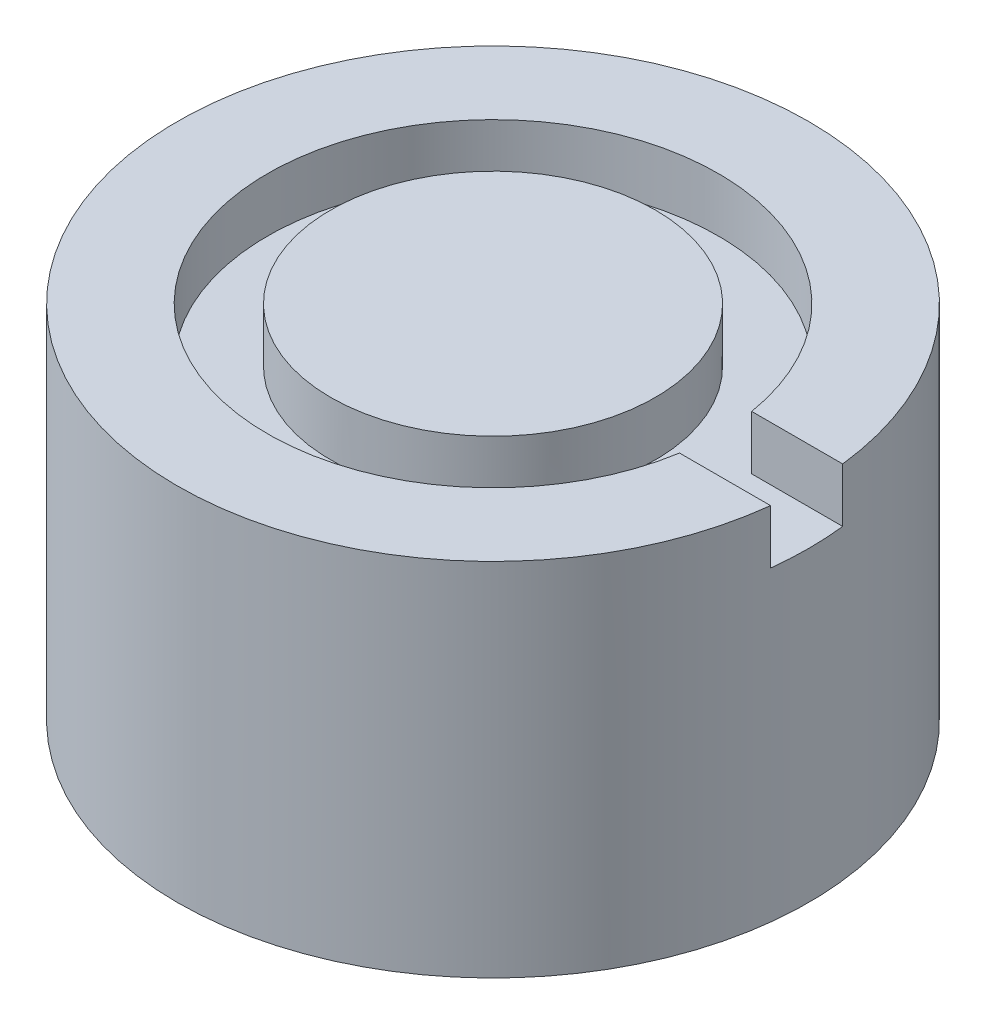
ISO-10303-21;
HEADER;
FILE_DESCRIPTION(('STEP AP214'),'2;1');
FILE_NAME('part.step','',(''),(''),'','','');
FILE_SCHEMA(('AUTOMOTIVE_DESIGN { 1 0 10303 214 1 1 1 1 }'));
ENDSEC;
DATA;
#1=APPLICATION_CONTEXT('core data for automotive mechanical design processes');
#2=APPLICATION_PROTOCOL_DEFINITION('international standard','automotive_design',2000,#1);
#3=PRODUCT_CONTEXT('',#1,'mechanical');
#4=PRODUCT('Part','Part','',(#3));
#5=PRODUCT_RELATED_PRODUCT_CATEGORY('part','',(#4));
#6=PRODUCT_DEFINITION_FORMATION('','',#4);
#7=PRODUCT_DEFINITION_CONTEXT('part definition',#1,'design');
#8=PRODUCT_DEFINITION('design','',#6,#7);
#9=PRODUCT_DEFINITION_SHAPE('','',#8);
#10=(LENGTH_UNIT() NAMED_UNIT(*) SI_UNIT(.MILLI.,.METRE.));
#11=(NAMED_UNIT(*) PLANE_ANGLE_UNIT() SI_UNIT($,.RADIAN.));
#12=(NAMED_UNIT(*) SI_UNIT($,.STERADIAN.) SOLID_ANGLE_UNIT());
#13=UNCERTAINTY_MEASURE_WITH_UNIT(LENGTH_MEASURE(1.E-05),#10,'distance_accuracy_value','');
#14=(GEOMETRIC_REPRESENTATION_CONTEXT(3) GLOBAL_UNCERTAINTY_ASSIGNED_CONTEXT((#13)) GLOBAL_UNIT_ASSIGNED_CONTEXT((#10,
#11,#12)) REPRESENTATION_CONTEXT('',''));
#15=CARTESIAN_POINT('',(0.,0.,0.));
#16=DIRECTION('',(0.,0.,1.));
#17=DIRECTION('',(1.,0.,0.));
#18=AXIS2_PLACEMENT_3D('',#15,#16,#17);
#19=CARTESIAN_POINT('',(0.,-1.,0.));
#20=DIRECTION('',(0.,-1.,0.));
#21=DIRECTION('',(0.,0.,-1.));
#22=AXIS2_PLACEMENT_3D('',#19,#20,#21);
#23=PLANE('',#22);
#24=CARTESIAN_POINT('',(0.,-1.,0.));
#25=DIRECTION('',(0.,-1.,0.));
#26=DIRECTION('',(0.,0.,-1.));
#27=AXIS2_PLACEMENT_3D('',#24,#25,#26);
#28=CIRCLE('',#27,6.);
#29=CARTESIAN_POINT('',(0.,-1.,-6.));
#30=VERTEX_POINT('',#29);
#31=EDGE_CURVE('E137',#30,#30,#28,.T.);
#32=ORIENTED_EDGE('',*,*,#31,.F.);
#33=EDGE_LOOP('',(#32));
#34=FACE_BOUND('',#33,.T.);
#35=CARTESIAN_POINT('',(0.,-1.,0.));
#36=DIRECTION('',(0.,-1.,0.));
#37=DIRECTION('',(0.,0.,-1.));
#38=AXIS2_PLACEMENT_3D('',#35,#36,#37);
#39=CIRCLE('',#38,11.);
#40=CARTESIAN_POINT('',(0.,-1.,-11.));
#41=VERTEX_POINT('',#40);
#42=EDGE_CURVE('E46',#41,#41,#39,.F.);
#43=ORIENTED_EDGE('',*,*,#42,.F.);
#44=EDGE_LOOP('',(#43));
#45=FACE_BOUND('',#44,.T.);
#46=ADVANCED_FACE('F38',(#34,#45),#23,.T.);
#47=CARTESIAN_POINT('',(0.,9.,0.));
#48=DIRECTION('',(0.,-1.,0.));
#49=DIRECTION('',(0.,0.,-1.));
#50=AXIS2_PLACEMENT_3D('',#47,#48,#49);
#51=CYLINDRICAL_SURFACE('',#50,3.05);
#52=CARTESIAN_POINT('',(0.,0.,0.));
#53=DIRECTION('',(0.,1.,0.));
#54=DIRECTION('',(0.,0.,1.));
#55=AXIS2_PLACEMENT_3D('',#52,#53,#54);
#56=CIRCLE('',#55,3.05);
#57=CARTESIAN_POINT('',(0.,0.,3.05));
#58=VERTEX_POINT('',#57);
#59=EDGE_CURVE('E165',#58,#58,#56,.T.);
#60=ORIENTED_EDGE('',*,*,#59,.F.);
#61=EDGE_LOOP('',(#60));
#62=FACE_BOUND('',#61,.T.);
#63=CARTESIAN_POINT('',(0.,9.,0.));
#64=DIRECTION('',(0.,1.,0.));
#65=DIRECTION('',(0.,0.,1.));
#66=AXIS2_PLACEMENT_3D('',#63,#64,#65);
#67=CIRCLE('',#66,3.05);
#68=CARTESIAN_POINT('',(0.45,9.,3.01662062579967));
#69=VERTEX_POINT('',#68);
#70=CARTESIAN_POINT('',(0.45,9.,-3.01662062579967));
#71=VERTEX_POINT('',#70);
#72=EDGE_CURVE('E162',#69,#71,#67,.T.);
#73=ORIENTED_EDGE('',*,*,#72,.T.);
#74=DIRECTION('',(0.,-1.,0.));
#75=VECTOR('',#74,1.);
#76=CARTESIAN_POINT('',(0.45,9.,-3.01662062579967));
#77=LINE('',#76,#75);
#78=CARTESIAN_POINT('',(0.45,8.,-3.01662062579967));
#79=VERTEX_POINT('',#78);
#80=EDGE_CURVE('E156',#71,#79,#77,.T.);
#81=ORIENTED_EDGE('',*,*,#80,.T.);
#82=CARTESIAN_POINT('',(0.,8.,0.));
#83=DIRECTION('',(0.,1.,0.));
#84=DIRECTION('',(0.,0.,1.));
#85=AXIS2_PLACEMENT_3D('',#82,#83,#84);
#86=CIRCLE('',#85,3.05);
#87=CARTESIAN_POINT('',(-0.45,8.,-3.01662062579967));
#88=VERTEX_POINT('',#87);
#89=EDGE_CURVE('E61',#79,#88,#86,.T.);
#90=ORIENTED_EDGE('',*,*,#89,.T.);
#91=DIRECTION('',(0.,-1.,0.));
#92=VECTOR('',#91,1.);
#93=CARTESIAN_POINT('',(-0.45,9.,-3.01662062579967));
#94=LINE('',#93,#92);
#95=CARTESIAN_POINT('',(-0.45,9.,-3.01662062579967));
#96=VERTEX_POINT('',#95);
#97=EDGE_CURVE('E150',#88,#96,#94,.F.);
#98=ORIENTED_EDGE('',*,*,#97,.T.);
#99=CARTESIAN_POINT('',(-0.45,9.,3.01662062579967));
#100=VERTEX_POINT('',#99);
#101=EDGE_CURVE('E161',#96,#100,#67,.T.);
#102=ORIENTED_EDGE('',*,*,#101,.T.);
#103=DIRECTION('',(0.,-1.,0.));
#104=VECTOR('',#103,1.);
#105=CARTESIAN_POINT('',(-0.45,9.,3.01662062579967));
#106=LINE('',#105,#104);
#107=CARTESIAN_POINT('',(-0.45,8.,3.01662062579967));
#108=VERTEX_POINT('',#107);
#109=EDGE_CURVE('E152',#100,#108,#106,.T.);
#110=ORIENTED_EDGE('',*,*,#109,.T.);
#111=CARTESIAN_POINT('',(0.45,8.,3.01662062579967));
#112=VERTEX_POINT('',#111);
#113=EDGE_CURVE('E177',#108,#112,#86,.T.);
#114=ORIENTED_EDGE('',*,*,#113,.T.);
#115=DIRECTION('',(0.,-1.,0.));
#116=VECTOR('',#115,1.);
#117=CARTESIAN_POINT('',(0.45,9.,3.01662062579967));
#118=LINE('',#117,#116);
#119=EDGE_CURVE('E154',#112,#69,#118,.F.);
#120=ORIENTED_EDGE('',*,*,#119,.T.);
#121=EDGE_LOOP('',(#73,#81,#90,#98,#102,#110,#114,#120));
#122=FACE_BOUND('',#121,.T.);
#123=ADVANCED_FACE('F184',(#62,#122),#51,.F.);
#124=CARTESIAN_POINT('',(0.,9.,0.));
#125=DIRECTION('',(0.,1.,0.));
#126=DIRECTION('',(0.,0.,1.));
#127=AXIS2_PLACEMENT_3D('',#124,#125,#126);
#128=PLANE('',#127);
#129=DIRECTION('',(0.,0.,1.));
#130=VECTOR('',#129,1.);
#131=CARTESIAN_POINT('',(0.45,9.,0.));
#132=LINE('',#131,#130);
#133=EDGE_CURVE('E174',#71,#69,#132,.T.);
#134=ORIENTED_EDGE('',*,*,#133,.F.);
#135=ORIENTED_EDGE('',*,*,#72,.F.);
#136=EDGE_LOOP('',(#134,#135));
#137=FACE_BOUND('',#136,.T.);
#138=ADVANCED_FACE('F190',(#137),#128,.F.);
#139=DIRECTION('',(0.,0.,-1.));
#140=VECTOR('',#139,1.);
#141=CARTESIAN_POINT('',(-0.45,9.,0.));
#142=LINE('',#141,#140);
#143=EDGE_CURVE('E171',#100,#96,#142,.T.);
#144=ORIENTED_EDGE('',*,*,#143,.F.);
#145=ORIENTED_EDGE('',*,*,#101,.F.);
#146=EDGE_LOOP('',(#144,#145));
#147=FACE_BOUND('',#146,.T.);
#148=ADVANCED_FACE('F221',(#147),#128,.F.);
#149=CARTESIAN_POINT('',(0.,0.,0.));
#150=DIRECTION('',(0.,1.,0.));
#151=DIRECTION('',(0.,0.,1.));
#152=AXIS2_PLACEMENT_3D('',#149,#150,#151);
#153=PLANE('',#152);
#154=CARTESIAN_POINT('',(0.,0.,0.));
#155=DIRECTION('',(0.,1.,0.));
#156=DIRECTION('',(0.,0.,1.));
#157=AXIS2_PLACEMENT_3D('',#154,#155,#156);
#158=CIRCLE('',#157,6.);
#159=CARTESIAN_POINT('',(0.,0.,6.));
#160=VERTEX_POINT('',#159);
#161=EDGE_CURVE('E168',#160,#160,#158,.T.);
#162=ORIENTED_EDGE('',*,*,#161,.F.);
#163=EDGE_LOOP('',(#162));
#164=FACE_BOUND('',#163,.T.);
#165=ORIENTED_EDGE('',*,*,#59,.T.);
#166=EDGE_LOOP('',(#165));
#167=FACE_BOUND('',#166,.T.);
#168=ADVANCED_FACE('F40',(#164,#167),#153,.F.);
#169=CARTESIAN_POINT('',(0.,8.,0.));
#170=DIRECTION('',(0.,1.,0.));
#171=DIRECTION('',(0.,0.,1.));
#172=AXIS2_PLACEMENT_3D('',#169,#170,#171);
#173=PLANE('',#172);
#174=ORIENTED_EDGE('',*,*,#89,.F.);
#175=DIRECTION('',(0.,0.,1.));
#176=VECTOR('',#175,1.);
#177=CARTESIAN_POINT('',(0.45,8.,-4.37971298198208));
#178=LINE('',#177,#176);
#179=EDGE_CURVE('E144',#79,#112,#178,.T.);
#180=ORIENTED_EDGE('',*,*,#179,.T.);
#181=ORIENTED_EDGE('',*,*,#113,.F.);
#182=DIRECTION('',(0.,0.,-1.));
#183=VECTOR('',#182,1.);
#184=CARTESIAN_POINT('',(-0.45,8.,-4.37971298198208));
#185=LINE('',#184,#183);
#186=EDGE_CURVE('E147',#108,#88,#185,.T.);
#187=ORIENTED_EDGE('',*,*,#186,.T.);
#188=EDGE_LOOP('',(#174,#180,#181,#187));
#189=FACE_BOUND('',#188,.T.);
#190=ADVANCED_FACE('F203',(#189),#173,.F.);
#191=CARTESIAN_POINT('',(0.45,8.,-4.37971298198208));
#192=DIRECTION('',(-1.,0.,0.));
#193=DIRECTION('',(0.,0.,1.));
#194=AXIS2_PLACEMENT_3D('',#191,#192,#193);
#195=PLANE('',#194);
#196=ORIENTED_EDGE('',*,*,#80,.F.);
#197=ORIENTED_EDGE('',*,*,#133,.T.);
#198=ORIENTED_EDGE('',*,*,#119,.F.);
#199=ORIENTED_EDGE('',*,*,#179,.F.);
#200=EDGE_LOOP('',(#196,#197,#198,#199));
#201=FACE_BOUND('',#200,.T.);
#202=ADVANCED_FACE('F206',(#201),#195,.F.);
#203=CARTESIAN_POINT('',(-0.45,8.,-4.37971298198208));
#204=DIRECTION('',(1.,0.,0.));
#205=DIRECTION('',(0.,0.,-1.));
#206=AXIS2_PLACEMENT_3D('',#203,#204,#205);
#207=PLANE('',#206);
#208=ORIENTED_EDGE('',*,*,#109,.F.);
#209=ORIENTED_EDGE('',*,*,#143,.T.);
#210=ORIENTED_EDGE('',*,*,#97,.F.);
#211=ORIENTED_EDGE('',*,*,#186,.F.);
#212=EDGE_LOOP('',(#208,#209,#210,#211));
#213=FACE_BOUND('',#212,.T.);
#214=ADVANCED_FACE('F208',(#213),#207,.F.);
#215=CARTESIAN_POINT('',(0.,-1.,0.));
#216=DIRECTION('',(0.,1.,0.));
#217=DIRECTION('',(0.,0.,1.));
#218=AXIS2_PLACEMENT_3D('',#215,#216,#217);
#219=CYLINDRICAL_SURFACE('',#218,6.);
#220=ORIENTED_EDGE('',*,*,#31,.T.);
#221=EDGE_LOOP('',(#220));
#222=FACE_BOUND('',#221,.T.);
#223=ORIENTED_EDGE('',*,*,#161,.T.);
#224=EDGE_LOOP('',(#223));
#225=FACE_BOUND('',#224,.T.);
#226=ADVANCED_FACE('F195',(#222,#225),#219,.F.);
#227=CARTESIAN_POINT('',(0.,-8.,0.));
#228=DIRECTION('',(0.,-1.,0.));
#229=DIRECTION('',(0.,0.,-1.));
#230=AXIS2_PLACEMENT_3D('',#227,#228,#229);
#231=PLANE('',#230);
#232=CARTESIAN_POINT('',(0.,-8.,0.));
#233=DIRECTION('',(0.,-1.,0.));
#234=DIRECTION('',(0.,0.,-1.));
#235=AXIS2_PLACEMENT_3D('',#232,#233,#234);
#236=CIRCLE('',#235,11.);
#237=CARTESIAN_POINT('',(0.,-8.,-11.));
#238=VERTEX_POINT('',#237);
#239=EDGE_CURVE('E133',#238,#238,#236,.T.);
#240=ORIENTED_EDGE('',*,*,#239,.F.);
#241=EDGE_LOOP('',(#240));
#242=FACE_BOUND('',#241,.T.);
#243=CARTESIAN_POINT('',(0.,-8.,0.));
#244=DIRECTION('',(0.,-1.,0.));
#245=DIRECTION('',(0.,0.,-1.));
#246=AXIS2_PLACEMENT_3D('',#243,#244,#245);
#247=CIRCLE('',#246,17.5);
#248=CARTESIAN_POINT('',(0.,-8.,-17.5));
#249=VERTEX_POINT('',#248);
#250=EDGE_CURVE('E124',#249,#249,#247,.T.);
#251=ORIENTED_EDGE('',*,*,#250,.T.);
#252=EDGE_LOOP('',(#251));
#253=FACE_BOUND('',#252,.T.);
#254=ADVANCED_FACE('F248',(#242,#253),#231,.T.);
#255=CARTESIAN_POINT('',(0.,-8.,0.));
#256=DIRECTION('',(0.,1.,0.));
#257=DIRECTION('',(0.,0.,1.));
#258=AXIS2_PLACEMENT_3D('',#255,#256,#257);
#259=CYLINDRICAL_SURFACE('',#258,11.);
#260=ORIENTED_EDGE('',*,*,#239,.T.);
#261=EDGE_LOOP('',(#260));
#262=FACE_BOUND('',#261,.T.);
#263=ORIENTED_EDGE('',*,*,#42,.T.);
#264=EDGE_LOOP('',(#263));
#265=FACE_BOUND('',#264,.T.);
#266=ADVANCED_FACE('F181',(#262,#265),#259,.F.);
#267=CARTESIAN_POINT('',(0.,12.,0.));
#268=DIRECTION('',(0.,-1.,0.));
#269=DIRECTION('',(0.,0.,-1.));
#270=AXIS2_PLACEMENT_3D('',#267,#268,#269);
#271=CYLINDRICAL_SURFACE('',#270,12.5);
#272=CARTESIAN_POINT('',(0.,12.,0.));
#273=DIRECTION('',(0.,-1.,0.));
#274=DIRECTION('',(0.,0.,-1.));
#275=AXIS2_PLACEMENT_3D('',#272,#273,#274);
#276=CIRCLE('',#275,12.5);
#277=CARTESIAN_POINT('',(12.3389626792531,12.,2.));
#278=VERTEX_POINT('',#277);
#279=CARTESIAN_POINT('',(12.3389626792531,12.,-2.));
#280=VERTEX_POINT('',#279);
#281=EDGE_CURVE('E117',#278,#280,#276,.T.);
#282=ORIENTED_EDGE('',*,*,#281,.F.);
#283=DIRECTION('',(0.,-1.,0.));
#284=VECTOR('',#283,1.);
#285=CARTESIAN_POINT('',(12.3389626792531,12.,2.));
#286=LINE('',#285,#284);
#287=CARTESIAN_POINT('',(12.3389626792531,9.00000000000001,2.));
#288=VERTEX_POINT('',#287);
#289=EDGE_CURVE('E125',#278,#288,#286,.T.);
#290=ORIENTED_EDGE('',*,*,#289,.T.);
#291=CARTESIAN_POINT('',(0.,9.,0.));
#292=DIRECTION('',(0.,-1.,0.));
#293=DIRECTION('',(0.,0.,-1.));
#294=AXIS2_PLACEMENT_3D('',#291,#292,#293);
#295=CIRCLE('',#294,12.5);
#296=CARTESIAN_POINT('',(12.3389626792531,9.00000000000001,-2.));
#297=VERTEX_POINT('',#296);
#298=EDGE_CURVE('E119',#288,#297,#295,.T.);
#299=ORIENTED_EDGE('',*,*,#298,.T.);
#300=DIRECTION('',(0.,-1.,0.));
#301=VECTOR('',#300,1.);
#302=CARTESIAN_POINT('',(12.3389626792531,12.,-2.));
#303=LINE('',#302,#301);
#304=EDGE_CURVE('E104',#297,#280,#303,.F.);
#305=ORIENTED_EDGE('',*,*,#304,.T.);
#306=EDGE_LOOP('',(#282,#290,#299,#305));
#307=FACE_BOUND('',#306,.T.);
#308=ADVANCED_FACE('F115',(#307),#271,.F.);
#309=CARTESIAN_POINT('',(0.,12.,0.));
#310=DIRECTION('',(0.,-1.,0.));
#311=DIRECTION('',(0.,0.,-1.));
#312=AXIS2_PLACEMENT_3D('',#309,#310,#311);
#313=CYLINDRICAL_SURFACE('',#312,17.5);
#314=DIRECTION('',(0.,-1.,0.));
#315=VECTOR('',#314,1.);
#316=CARTESIAN_POINT('',(17.3853386507137,12.,2.));
#317=LINE('',#316,#315);
#318=CARTESIAN_POINT('',(17.3853386507137,12.,2.));
#319=VERTEX_POINT('',#318);
#320=CARTESIAN_POINT('',(17.3853386507137,9.00000000000001,2.));
#321=VERTEX_POINT('',#320);
#322=EDGE_CURVE('E120',#319,#321,#317,.T.);
#323=ORIENTED_EDGE('',*,*,#322,.F.);
#324=CARTESIAN_POINT('',(0.,12.,0.));
#325=DIRECTION('',(0.,-1.,0.));
#326=DIRECTION('',(0.,0.,-1.));
#327=AXIS2_PLACEMENT_3D('',#324,#325,#326);
#328=CIRCLE('',#327,17.5);
#329=CARTESIAN_POINT('',(17.3853386507137,12.,-2.));
#330=VERTEX_POINT('',#329);
#331=EDGE_CURVE('E128',#319,#330,#328,.T.);
#332=ORIENTED_EDGE('',*,*,#331,.T.);
#333=DIRECTION('',(0.,-1.,0.));
#334=VECTOR('',#333,1.);
#335=CARTESIAN_POINT('',(17.3853386507137,12.,-2.));
#336=LINE('',#335,#334);
#337=CARTESIAN_POINT('',(17.3853386507137,9.00000000000001,-2.));
#338=VERTEX_POINT('',#337);
#339=EDGE_CURVE('E53',#338,#330,#336,.F.);
#340=ORIENTED_EDGE('',*,*,#339,.F.);
#341=CARTESIAN_POINT('',(0.,9.00000000000001,0.));
#342=DIRECTION('',(0.,-1.,0.));
#343=DIRECTION('',(0.,0.,-1.));
#344=AXIS2_PLACEMENT_3D('',#341,#342,#343);
#345=CIRCLE('',#344,17.5);
#346=EDGE_CURVE('E11',#321,#338,#345,.F.);
#347=ORIENTED_EDGE('',*,*,#346,.F.);
#348=EDGE_LOOP('',(#323,#332,#340,#347));
#349=FACE_BOUND('',#348,.T.);
#350=ORIENTED_EDGE('',*,*,#250,.F.);
#351=EDGE_LOOP('',(#350));
#352=FACE_BOUND('',#351,.T.);
#353=ADVANCED_FACE('F242',(#349,#352),#313,.T.);
#354=CARTESIAN_POINT('',(0.,12.,0.));
#355=DIRECTION('',(0.,-1.,0.));
#356=DIRECTION('',(0.,0.,-1.));
#357=AXIS2_PLACEMENT_3D('',#354,#355,#356);
#358=PLANE('',#357);
#359=ORIENTED_EDGE('',*,*,#331,.F.);
#360=DIRECTION('',(1.,0.,0.));
#361=VECTOR('',#360,1.);
#362=CARTESIAN_POINT('',(11.8882945725748,12.,2.));
#363=LINE('',#362,#361);
#364=EDGE_CURVE('E110',#278,#319,#363,.T.);
#365=ORIENTED_EDGE('',*,*,#364,.F.);
#366=ORIENTED_EDGE('',*,*,#281,.T.);
#367=DIRECTION('',(-1.,0.,0.));
#368=VECTOR('',#367,1.);
#369=CARTESIAN_POINT('',(11.8882945725748,12.,-2.));
#370=LINE('',#369,#368);
#371=EDGE_CURVE('E101',#330,#280,#370,.T.);
#372=ORIENTED_EDGE('',*,*,#371,.F.);
#373=EDGE_LOOP('',(#359,#365,#366,#372));
#374=FACE_BOUND('',#373,.T.);
#375=ADVANCED_FACE('F123',(#374),#358,.F.);
#376=CARTESIAN_POINT('',(0.,12.,0.));
#377=DIRECTION('',(0.,1.,0.));
#378=DIRECTION('',(0.,0.,1.));
#379=AXIS2_PLACEMENT_3D('',#376,#377,#378);
#380=PLANE('',#379);
#381=CARTESIAN_POINT('',(0.,12.,0.));
#382=DIRECTION('',(0.,1.,0.));
#383=DIRECTION('',(0.,0.,1.));
#384=AXIS2_PLACEMENT_3D('',#381,#382,#383);
#385=CIRCLE('',#384,9.);
#386=CARTESIAN_POINT('',(0.,12.,9.));
#387=VERTEX_POINT('',#386);
#388=EDGE_CURVE('E158',#387,#387,#385,.T.);
#389=ORIENTED_EDGE('',*,*,#388,.T.);
#390=EDGE_LOOP('',(#389));
#391=FACE_BOUND('',#390,.T.);
#392=ADVANCED_FACE('F215',(#391),#380,.T.);
#393=CARTESIAN_POINT('',(0.,12.,0.));
#394=DIRECTION('',(0.,-1.,0.));
#395=DIRECTION('',(0.,0.,-1.));
#396=AXIS2_PLACEMENT_3D('',#393,#394,#395);
#397=CYLINDRICAL_SURFACE('',#396,9.);
#398=ORIENTED_EDGE('',*,*,#388,.F.);
#399=EDGE_LOOP('',(#398));
#400=FACE_BOUND('',#399,.T.);
#401=CARTESIAN_POINT('',(0.,9.,0.));
#402=DIRECTION('',(0.,-1.,0.));
#403=DIRECTION('',(0.,0.,-1.));
#404=AXIS2_PLACEMENT_3D('',#401,#402,#403);
#405=CIRCLE('',#404,9.);
#406=CARTESIAN_POINT('',(0.,9.,-9.));
#407=VERTEX_POINT('',#406);
#408=EDGE_CURVE('E141',#407,#407,#405,.T.);
#409=ORIENTED_EDGE('',*,*,#408,.F.);
#410=EDGE_LOOP('',(#409));
#411=FACE_BOUND('',#410,.T.);
#412=ADVANCED_FACE('F201',(#400,#411),#397,.T.);
#413=CARTESIAN_POINT('',(0.,9.,0.));
#414=DIRECTION('',(0.,-1.,0.));
#415=DIRECTION('',(0.,0.,-1.));
#416=AXIS2_PLACEMENT_3D('',#413,#414,#415);
#417=PLANE('',#416);
#418=ORIENTED_EDGE('',*,*,#408,.T.);
#419=EDGE_LOOP('',(#418));
#420=FACE_BOUND('',#419,.T.);
#421=ORIENTED_EDGE('',*,*,#298,.F.);
#422=DIRECTION('',(1.,0.,0.));
#423=VECTOR('',#422,1.);
#424=CARTESIAN_POINT('',(11.8882945725748,9.00000000000001,2.));
#425=LINE('',#424,#423);
#426=EDGE_CURVE('E232',#288,#321,#425,.T.);
#427=ORIENTED_EDGE('',*,*,#426,.T.);
#428=ORIENTED_EDGE('',*,*,#346,.T.);
#429=DIRECTION('',(-1.,0.,0.));
#430=VECTOR('',#429,1.);
#431=CARTESIAN_POINT('',(11.8882945725748,9.00000000000001,-2.));
#432=LINE('',#431,#430);
#433=EDGE_CURVE('E234',#338,#297,#432,.T.);
#434=ORIENTED_EDGE('',*,*,#433,.T.);
#435=EDGE_LOOP('',(#421,#427,#428,#434));
#436=FACE_BOUND('',#435,.T.);
#437=ADVANCED_FACE('F197',(#420,#436),#417,.F.);
#438=CARTESIAN_POINT('',(11.8882945725748,9.00000000000001,2.));
#439=DIRECTION('',(0.,0.,1.));
#440=DIRECTION('',(1.,0.,0.));
#441=AXIS2_PLACEMENT_3D('',#438,#439,#440);
#442=PLANE('',#441);
#443=ORIENTED_EDGE('',*,*,#364,.T.);
#444=ORIENTED_EDGE('',*,*,#322,.T.);
#445=ORIENTED_EDGE('',*,*,#426,.F.);
#446=ORIENTED_EDGE('',*,*,#289,.F.);
#447=EDGE_LOOP('',(#443,#444,#445,#446));
#448=FACE_BOUND('',#447,.T.);
#449=ADVANCED_FACE('F200',(#448),#442,.F.);
#450=CARTESIAN_POINT('',(11.8882945725748,9.00000000000001,-2.));
#451=DIRECTION('',(0.,0.,-1.));
#452=DIRECTION('',(-1.,0.,0.));
#453=AXIS2_PLACEMENT_3D('',#450,#451,#452);
#454=PLANE('',#453);
#455=ORIENTED_EDGE('',*,*,#433,.F.);
#456=ORIENTED_EDGE('',*,*,#339,.T.);
#457=ORIENTED_EDGE('',*,*,#371,.T.);
#458=ORIENTED_EDGE('',*,*,#304,.F.);
#459=EDGE_LOOP('',(#455,#456,#457,#458));
#460=FACE_BOUND('',#459,.T.);
#461=ADVANCED_FACE('F103',(#460),#454,.F.);
#462=CLOSED_SHELL('',(#46,#123,#138,#148,#168,#190,#202,#214,#226,#254,#266,#308,#353,#375,#392,
#412,#437,#449,#461));
#463=MANIFOLD_SOLID_BREP('B2',#462);
#464=ADVANCED_BREP_SHAPE_REPRESENTATION('',(#18,#463),#14);
#465=SHAPE_DEFINITION_REPRESENTATION(#9,#464);
ENDSEC;
END-ISO-10303-21;
